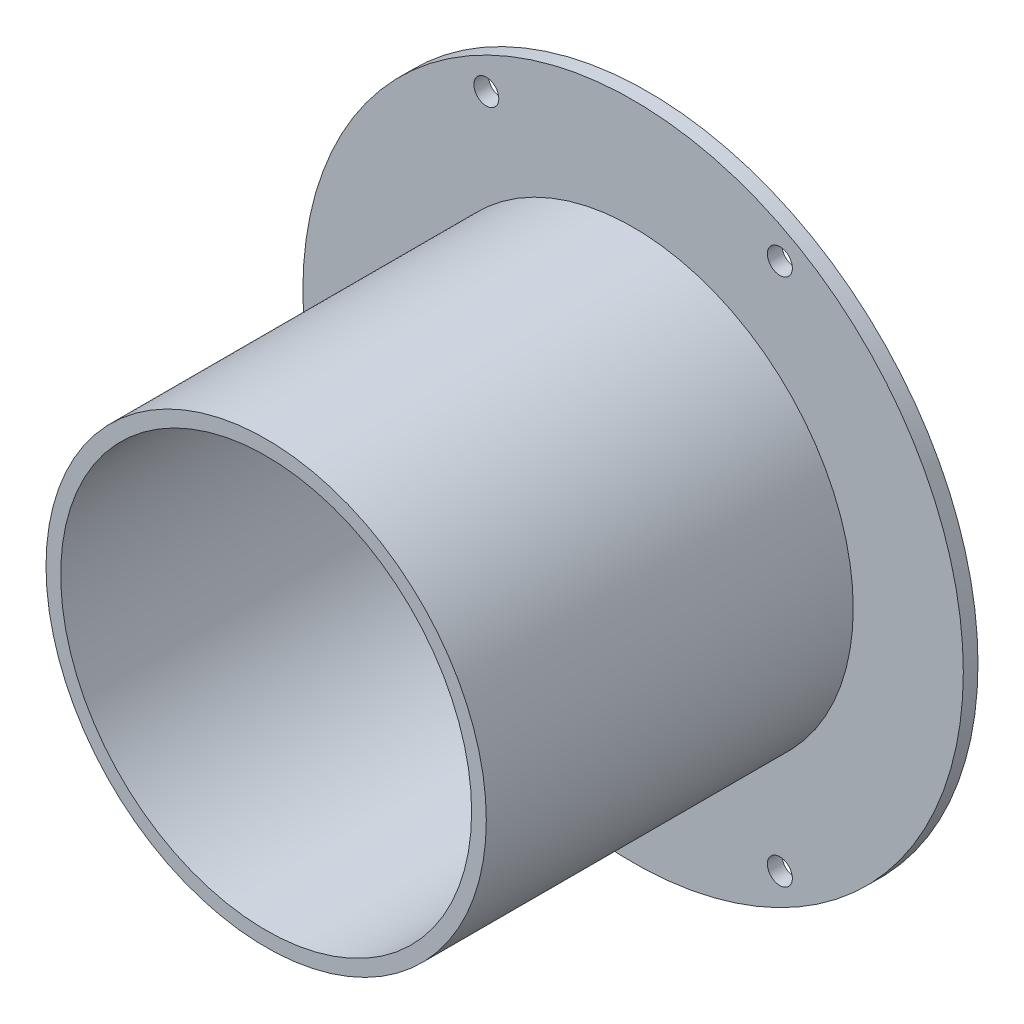
ISO-10303-21;
HEADER;
FILE_DESCRIPTION(('STEP AP214'),'2;1');
FILE_NAME('part.step','',(''),(''),'','','');
FILE_SCHEMA(('AUTOMOTIVE_DESIGN { 1 0 10303 214 1 1 1 1 }'));
ENDSEC;
DATA;
#1=APPLICATION_CONTEXT('core data for automotive mechanical design processes');
#2=APPLICATION_PROTOCOL_DEFINITION('international standard','automotive_design',2000,#1);
#3=PRODUCT_CONTEXT('',#1,'mechanical');
#4=PRODUCT('Part','Part','',(#3));
#5=PRODUCT_RELATED_PRODUCT_CATEGORY('part','',(#4));
#6=PRODUCT_DEFINITION_FORMATION('','',#4);
#7=PRODUCT_DEFINITION_CONTEXT('part definition',#1,'design');
#8=PRODUCT_DEFINITION('design','',#6,#7);
#9=PRODUCT_DEFINITION_SHAPE('','',#8);
#10=(LENGTH_UNIT() NAMED_UNIT(*) SI_UNIT(.MILLI.,.METRE.));
#11=(NAMED_UNIT(*) PLANE_ANGLE_UNIT() SI_UNIT($,.RADIAN.));
#12=(NAMED_UNIT(*) SI_UNIT($,.STERADIAN.) SOLID_ANGLE_UNIT());
#13=UNCERTAINTY_MEASURE_WITH_UNIT(LENGTH_MEASURE(1.E-05),#10,'distance_accuracy_value','');
#14=(GEOMETRIC_REPRESENTATION_CONTEXT(3) GLOBAL_UNCERTAINTY_ASSIGNED_CONTEXT((#13)) GLOBAL_UNIT_ASSIGNED_CONTEXT((#10,
#11,#12)) REPRESENTATION_CONTEXT('',''));
#15=CARTESIAN_POINT('',(0.,0.,0.));
#16=DIRECTION('',(0.,0.,1.));
#17=DIRECTION('',(1.,0.,0.));
#18=AXIS2_PLACEMENT_3D('',#15,#16,#17);
#19=CARTESIAN_POINT('',(0.,0.,2.));
#20=DIRECTION('',(0.,0.,1.));
#21=DIRECTION('',(1.,0.,0.));
#22=AXIS2_PLACEMENT_3D('',#19,#20,#21);
#23=PLANE('',#22);
#24=CARTESIAN_POINT('',(0.,0.,2.));
#25=DIRECTION('',(0.,0.,1.));
#26=DIRECTION('',(1.,0.,0.));
#27=AXIS2_PLACEMENT_3D('',#24,#25,#26);
#28=CIRCLE('',#27,7.);
#29=CARTESIAN_POINT('',(7.,0.,2.));
#30=VERTEX_POINT('',#29);
#31=EDGE_CURVE('E53',#30,#30,#28,.T.);
#32=ORIENTED_EDGE('',*,*,#31,.F.);
#33=EDGE_LOOP('',(#32));
#34=FACE_BOUND('',#33,.T.);
#35=CARTESIAN_POINT('',(0.,0.,2.));
#36=DIRECTION('',(0.,0.,1.));
#37=DIRECTION('',(1.,0.,0.));
#38=AXIS2_PLACEMENT_3D('',#35,#36,#37);
#39=CIRCLE('',#38,28.);
#40=CARTESIAN_POINT('',(28.,0.,2.));
#41=VERTEX_POINT('',#40);
#42=EDGE_CURVE('E67',#41,#41,#39,.T.);
#43=ORIENTED_EDGE('',*,*,#42,.T.);
#44=EDGE_LOOP('',(#43));
#45=FACE_BOUND('',#44,.T.);
#46=ADVANCED_FACE('F40',(#34,#45),#23,.T.);
#47=CARTESIAN_POINT('',(-20.,36.,2.));
#48=DIRECTION('',(0.,0.,1.));
#49=DIRECTION('',(1.,0.,0.));
#50=AXIS2_PLACEMENT_3D('',#47,#48,#49);
#51=CIRCLE('',#50,1.7);
#52=CARTESIAN_POINT('',(-18.3,36.,2.));
#53=VERTEX_POINT('',#52);
#54=EDGE_CURVE('E72',#53,#53,#51,.T.);
#55=ORIENTED_EDGE('',*,*,#54,.F.);
#56=EDGE_LOOP('',(#55));
#57=FACE_BOUND('',#56,.T.);
#58=CARTESIAN_POINT('',(20.,-36.,2.));
#59=DIRECTION('',(0.,0.,1.));
#60=DIRECTION('',(1.,0.,0.));
#61=AXIS2_PLACEMENT_3D('',#58,#59,#60);
#62=CIRCLE('',#61,1.7);
#63=CARTESIAN_POINT('',(21.7,-36.,2.));
#64=VERTEX_POINT('',#63);
#65=EDGE_CURVE('E73',#64,#64,#62,.T.);
#66=ORIENTED_EDGE('',*,*,#65,.F.);
#67=EDGE_LOOP('',(#66));
#68=FACE_BOUND('',#67,.T.);
#69=CARTESIAN_POINT('',(20.,36.,2.));
#70=DIRECTION('',(0.,0.,1.));
#71=DIRECTION('',(1.,0.,0.));
#72=AXIS2_PLACEMENT_3D('',#69,#70,#71);
#73=CIRCLE('',#72,1.7);
#74=CARTESIAN_POINT('',(21.7,36.,2.));
#75=VERTEX_POINT('',#74);
#76=EDGE_CURVE('E80',#75,#75,#73,.T.);
#77=ORIENTED_EDGE('',*,*,#76,.F.);
#78=EDGE_LOOP('',(#77));
#79=FACE_BOUND('',#78,.T.);
#80=CARTESIAN_POINT('',(-20.,-36.,2.));
#81=DIRECTION('',(0.,0.,1.));
#82=DIRECTION('',(1.,0.,0.));
#83=AXIS2_PLACEMENT_3D('',#80,#81,#82);
#84=CIRCLE('',#83,1.7);
#85=CARTESIAN_POINT('',(-18.3,-36.,2.));
#86=VERTEX_POINT('',#85);
#87=EDGE_CURVE('E82',#86,#86,#84,.T.);
#88=ORIENTED_EDGE('',*,*,#87,.F.);
#89=EDGE_LOOP('',(#88));
#90=FACE_BOUND('',#89,.T.);
#91=CARTESIAN_POINT('',(0.,0.,2.));
#92=DIRECTION('',(0.,0.,1.));
#93=DIRECTION('',(1.,0.,0.));
#94=AXIS2_PLACEMENT_3D('',#91,#92,#93);
#95=CIRCLE('',#94,30.);
#96=CARTESIAN_POINT('',(30.,0.,2.));
#97=VERTEX_POINT('',#96);
#98=EDGE_CURVE('E10',#97,#97,#95,.T.);
#99=ORIENTED_EDGE('',*,*,#98,.F.);
#100=EDGE_LOOP('',(#99));
#101=FACE_BOUND('',#100,.T.);
#102=CARTESIAN_POINT('',(0.,0.,2.));
#103=DIRECTION('',(0.,0.,1.));
#104=DIRECTION('',(1.,0.,0.));
#105=AXIS2_PLACEMENT_3D('',#102,#103,#104);
#106=CIRCLE('',#105,45.);
#107=CARTESIAN_POINT('',(45.,0.,2.));
#108=VERTEX_POINT('',#107);
#109=EDGE_CURVE('E44',#108,#108,#106,.T.);
#110=ORIENTED_EDGE('',*,*,#109,.T.);
#111=EDGE_LOOP('',(#110));
#112=FACE_BOUND('',#111,.T.);
#113=ADVANCED_FACE('F105',(#57,#68,#79,#90,#101,#112),#23,.T.);
#114=CARTESIAN_POINT('',(0.,0.,0.));
#115=DIRECTION('',(0.,0.,1.));
#116=DIRECTION('',(1.,0.,0.));
#117=AXIS2_PLACEMENT_3D('',#114,#115,#116);
#118=PLANE('',#117);
#119=CARTESIAN_POINT('',(-20.,36.,0.));
#120=DIRECTION('',(0.,0.,-1.));
#121=DIRECTION('',(-1.,0.,0.));
#122=AXIS2_PLACEMENT_3D('',#119,#120,#121);
#123=CIRCLE('',#122,1.7);
#124=CARTESIAN_POINT('',(-21.7,36.,0.));
#125=VERTEX_POINT('',#124);
#126=EDGE_CURVE('E87',#125,#125,#123,.T.);
#127=ORIENTED_EDGE('',*,*,#126,.F.);
#128=EDGE_LOOP('',(#127));
#129=FACE_BOUND('',#128,.T.);
#130=CARTESIAN_POINT('',(20.,-36.,0.));
#131=DIRECTION('',(0.,0.,-1.));
#132=DIRECTION('',(-1.,0.,0.));
#133=AXIS2_PLACEMENT_3D('',#130,#131,#132);
#134=CIRCLE('',#133,1.7);
#135=CARTESIAN_POINT('',(18.3,-36.,0.));
#136=VERTEX_POINT('',#135);
#137=EDGE_CURVE('E86',#136,#136,#134,.T.);
#138=ORIENTED_EDGE('',*,*,#137,.F.);
#139=EDGE_LOOP('',(#138));
#140=FACE_BOUND('',#139,.T.);
#141=CARTESIAN_POINT('',(20.,36.,0.));
#142=DIRECTION('',(0.,0.,-1.));
#143=DIRECTION('',(-1.,0.,0.));
#144=AXIS2_PLACEMENT_3D('',#141,#142,#143);
#145=CIRCLE('',#144,1.7);
#146=CARTESIAN_POINT('',(18.3,36.,0.));
#147=VERTEX_POINT('',#146);
#148=EDGE_CURVE('E93',#147,#147,#145,.T.);
#149=ORIENTED_EDGE('',*,*,#148,.F.);
#150=EDGE_LOOP('',(#149));
#151=FACE_BOUND('',#150,.T.);
#152=CARTESIAN_POINT('',(-20.,-36.,0.));
#153=DIRECTION('',(0.,0.,-1.));
#154=DIRECTION('',(-1.,0.,0.));
#155=AXIS2_PLACEMENT_3D('',#152,#153,#154);
#156=CIRCLE('',#155,1.7);
#157=CARTESIAN_POINT('',(-21.7,-36.,0.));
#158=VERTEX_POINT('',#157);
#159=EDGE_CURVE('E81',#158,#158,#156,.T.);
#160=ORIENTED_EDGE('',*,*,#159,.F.);
#161=EDGE_LOOP('',(#160));
#162=FACE_BOUND('',#161,.T.);
#163=CARTESIAN_POINT('',(0.,0.,0.));
#164=DIRECTION('',(0.,0.,1.));
#165=DIRECTION('',(1.,0.,0.));
#166=AXIS2_PLACEMENT_3D('',#163,#164,#165);
#167=CIRCLE('',#166,45.);
#168=CARTESIAN_POINT('',(45.,0.,0.));
#169=VERTEX_POINT('',#168);
#170=EDGE_CURVE('E41',#169,#169,#167,.T.);
#171=ORIENTED_EDGE('',*,*,#170,.F.);
#172=EDGE_LOOP('',(#171));
#173=FACE_BOUND('',#172,.T.);
#174=CARTESIAN_POINT('',(0.,0.,0.));
#175=DIRECTION('',(0.,0.,1.));
#176=DIRECTION('',(1.,0.,0.));
#177=AXIS2_PLACEMENT_3D('',#174,#175,#176);
#178=CIRCLE('',#177,7.);
#179=CARTESIAN_POINT('',(7.,0.,0.));
#180=VERTEX_POINT('',#179);
#181=EDGE_CURVE('E60',#180,#180,#178,.T.);
#182=ORIENTED_EDGE('',*,*,#181,.T.);
#183=EDGE_LOOP('',(#182));
#184=FACE_BOUND('',#183,.T.);
#185=ADVANCED_FACE('F97',(#129,#140,#151,#162,#173,#184),#118,.F.);
#186=CARTESIAN_POINT('',(0.,0.,2.));
#187=DIRECTION('',(0.,0.,-1.));
#188=DIRECTION('',(-1.,0.,0.));
#189=AXIS2_PLACEMENT_3D('',#186,#187,#188);
#190=CYLINDRICAL_SURFACE('',#189,45.);
#191=ORIENTED_EDGE('',*,*,#109,.F.);
#192=EDGE_LOOP('',(#191));
#193=FACE_BOUND('',#192,.T.);
#194=ORIENTED_EDGE('',*,*,#170,.T.);
#195=EDGE_LOOP('',(#194));
#196=FACE_BOUND('',#195,.T.);
#197=ADVANCED_FACE('F39',(#193,#196),#190,.T.);
#198=CARTESIAN_POINT('',(0.,0.,2.));
#199=DIRECTION('',(0.,0.,-1.));
#200=DIRECTION('',(-1.,0.,0.));
#201=AXIS2_PLACEMENT_3D('',#198,#199,#200);
#202=CYLINDRICAL_SURFACE('',#201,7.);
#203=ORIENTED_EDGE('',*,*,#31,.T.);
#204=EDGE_LOOP('',(#203));
#205=FACE_BOUND('',#204,.T.);
#206=ORIENTED_EDGE('',*,*,#181,.F.);
#207=EDGE_LOOP('',(#206));
#208=FACE_BOUND('',#207,.T.);
#209=ADVANCED_FACE('F109',(#205,#208),#202,.F.);
#210=CARTESIAN_POINT('',(0.,0.,52.));
#211=DIRECTION('',(0.,0.,1.));
#212=DIRECTION('',(1.,0.,0.));
#213=AXIS2_PLACEMENT_3D('',#210,#211,#212);
#214=PLANE('',#213);
#215=CARTESIAN_POINT('',(0.,0.,52.));
#216=DIRECTION('',(0.,0.,1.));
#217=DIRECTION('',(1.,0.,0.));
#218=AXIS2_PLACEMENT_3D('',#215,#216,#217);
#219=CIRCLE('',#218,30.);
#220=CARTESIAN_POINT('',(30.,0.,52.));
#221=VERTEX_POINT('',#220);
#222=EDGE_CURVE('E55',#221,#221,#219,.T.);
#223=ORIENTED_EDGE('',*,*,#222,.T.);
#224=EDGE_LOOP('',(#223));
#225=FACE_BOUND('',#224,.T.);
#226=CARTESIAN_POINT('',(0.,0.,52.));
#227=DIRECTION('',(0.,0.,1.));
#228=DIRECTION('',(1.,0.,0.));
#229=AXIS2_PLACEMENT_3D('',#226,#227,#228);
#230=CIRCLE('',#229,28.);
#231=CARTESIAN_POINT('',(28.,0.,52.));
#232=VERTEX_POINT('',#231);
#233=EDGE_CURVE('E61',#232,#232,#230,.T.);
#234=ORIENTED_EDGE('',*,*,#233,.F.);
#235=EDGE_LOOP('',(#234));
#236=FACE_BOUND('',#235,.T.);
#237=ADVANCED_FACE('F113',(#225,#236),#214,.T.);
#238=CARTESIAN_POINT('',(0.,0.,52.));
#239=DIRECTION('',(0.,0.,-1.));
#240=DIRECTION('',(-1.,0.,0.));
#241=AXIS2_PLACEMENT_3D('',#238,#239,#240);
#242=CYLINDRICAL_SURFACE('',#241,30.);
#243=ORIENTED_EDGE('',*,*,#222,.F.);
#244=EDGE_LOOP('',(#243));
#245=FACE_BOUND('',#244,.T.);
#246=ORIENTED_EDGE('',*,*,#98,.T.);
#247=EDGE_LOOP('',(#246));
#248=FACE_BOUND('',#247,.T.);
#249=ADVANCED_FACE('F128',(#245,#248),#242,.T.);
#250=CARTESIAN_POINT('',(0.,0.,52.));
#251=DIRECTION('',(0.,0.,-1.));
#252=DIRECTION('',(-1.,0.,0.));
#253=AXIS2_PLACEMENT_3D('',#250,#251,#252);
#254=CYLINDRICAL_SURFACE('',#253,28.);
#255=ORIENTED_EDGE('',*,*,#233,.T.);
#256=EDGE_LOOP('',(#255));
#257=FACE_BOUND('',#256,.T.);
#258=ORIENTED_EDGE('',*,*,#42,.F.);
#259=EDGE_LOOP('',(#258));
#260=FACE_BOUND('',#259,.T.);
#261=ADVANCED_FACE('F135',(#257,#260),#254,.F.);
#262=CARTESIAN_POINT('',(-20.,-36.,2.01));
#263=DIRECTION('',(0.,0.,-1.));
#264=DIRECTION('',(-1.,0.,0.));
#265=AXIS2_PLACEMENT_3D('',#262,#263,#264);
#266=CYLINDRICAL_SURFACE('',#265,1.7);
#267=ORIENTED_EDGE('',*,*,#87,.T.);
#268=EDGE_LOOP('',(#267));
#269=FACE_BOUND('',#268,.T.);
#270=ORIENTED_EDGE('',*,*,#159,.T.);
#271=EDGE_LOOP('',(#270));
#272=FACE_BOUND('',#271,.T.);
#273=ADVANCED_FACE('F139',(#269,#272),#266,.F.);
#274=CARTESIAN_POINT('',(20.,36.,2.01));
#275=DIRECTION('',(0.,0.,-1.));
#276=DIRECTION('',(-1.,0.,0.));
#277=AXIS2_PLACEMENT_3D('',#274,#275,#276);
#278=CYLINDRICAL_SURFACE('',#277,1.7);
#279=ORIENTED_EDGE('',*,*,#76,.T.);
#280=EDGE_LOOP('',(#279));
#281=FACE_BOUND('',#280,.T.);
#282=ORIENTED_EDGE('',*,*,#148,.T.);
#283=EDGE_LOOP('',(#282));
#284=FACE_BOUND('',#283,.T.);
#285=ADVANCED_FACE('F100',(#281,#284),#278,.F.);
#286=CARTESIAN_POINT('',(20.,-36.,2.01));
#287=DIRECTION('',(0.,0.,-1.));
#288=DIRECTION('',(-1.,0.,0.));
#289=AXIS2_PLACEMENT_3D('',#286,#287,#288);
#290=CYLINDRICAL_SURFACE('',#289,1.7);
#291=ORIENTED_EDGE('',*,*,#65,.T.);
#292=EDGE_LOOP('',(#291));
#293=FACE_BOUND('',#292,.T.);
#294=ORIENTED_EDGE('',*,*,#137,.T.);
#295=EDGE_LOOP('',(#294));
#296=FACE_BOUND('',#295,.T.);
#297=ADVANCED_FACE('F142',(#293,#296),#290,.F.);
#298=CARTESIAN_POINT('',(-20.,36.,2.01));
#299=DIRECTION('',(0.,0.,-1.));
#300=DIRECTION('',(-1.,0.,0.));
#301=AXIS2_PLACEMENT_3D('',#298,#299,#300);
#302=CYLINDRICAL_SURFACE('',#301,1.7);
#303=ORIENTED_EDGE('',*,*,#54,.T.);
#304=EDGE_LOOP('',(#303));
#305=FACE_BOUND('',#304,.T.);
#306=ORIENTED_EDGE('',*,*,#126,.T.);
#307=EDGE_LOOP('',(#306));
#308=FACE_BOUND('',#307,.T.);
#309=ADVANCED_FACE('F144',(#305,#308),#302,.F.);
#310=CLOSED_SHELL('',(#46,#113,#185,#197,#209,#237,#249,#261,#273,#285,#297,#309));
#311=MANIFOLD_SOLID_BREP('B2',#310);
#312=ADVANCED_BREP_SHAPE_REPRESENTATION('',(#18,#311),#14);
#313=SHAPE_DEFINITION_REPRESENTATION(#9,#312);
ENDSEC;
END-ISO-10303-21;
